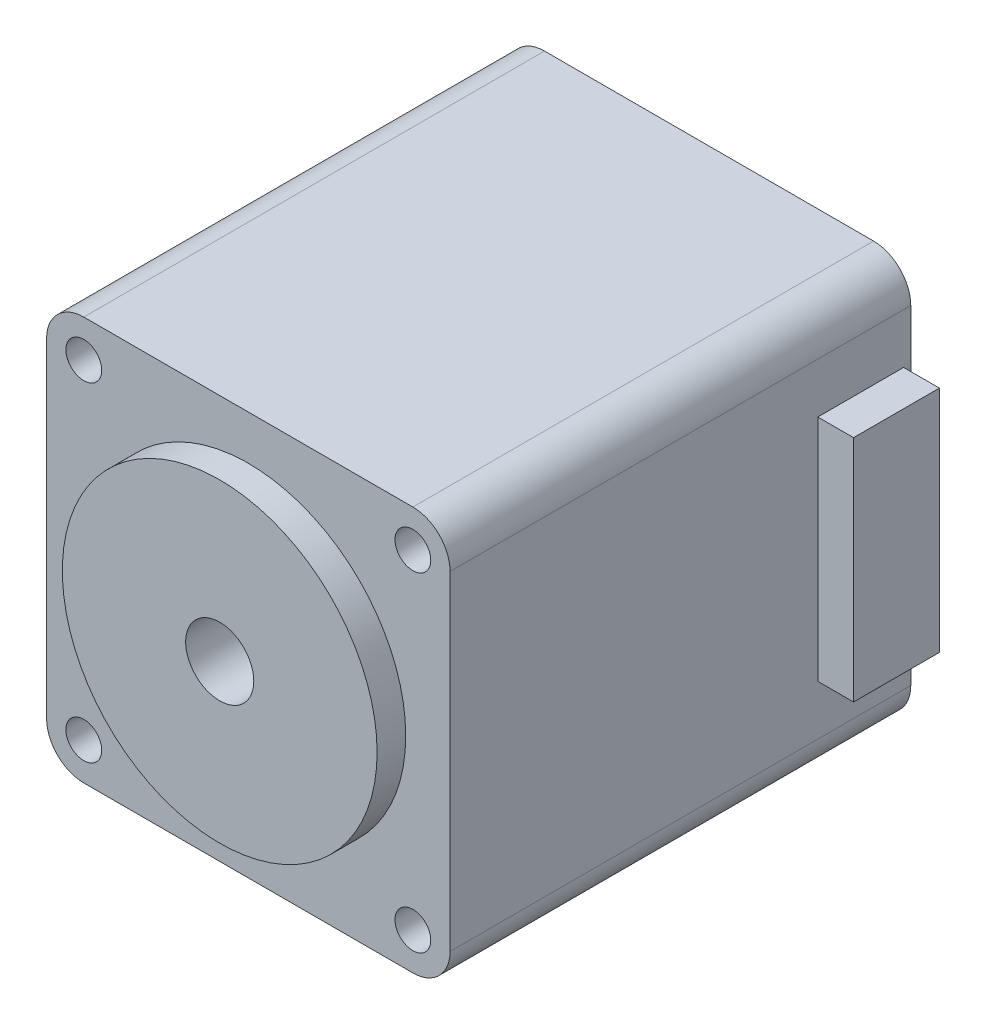
ISO-10303-21;
HEADER;
FILE_DESCRIPTION(('STEP AP214'),'2;1');
FILE_NAME('part.step','',(''),(''),'','','');
FILE_SCHEMA(('AUTOMOTIVE_DESIGN { 1 0 10303 214 1 1 1 1 }'));
ENDSEC;
DATA;
#1=APPLICATION_CONTEXT('core data for automotive mechanical design processes');
#2=APPLICATION_PROTOCOL_DEFINITION('international standard','automotive_design',2000,#1);
#3=PRODUCT_CONTEXT('',#1,'mechanical');
#4=PRODUCT('Part','Part','',(#3));
#5=PRODUCT_RELATED_PRODUCT_CATEGORY('part','',(#4));
#6=PRODUCT_DEFINITION_FORMATION('','',#4);
#7=PRODUCT_DEFINITION_CONTEXT('part definition',#1,'design');
#8=PRODUCT_DEFINITION('design','',#6,#7);
#9=PRODUCT_DEFINITION_SHAPE('','',#8);
#10=(LENGTH_UNIT() NAMED_UNIT(*) SI_UNIT(.MILLI.,.METRE.));
#11=(NAMED_UNIT(*) PLANE_ANGLE_UNIT() SI_UNIT($,.RADIAN.));
#12=(NAMED_UNIT(*) SI_UNIT($,.STERADIAN.) SOLID_ANGLE_UNIT());
#13=UNCERTAINTY_MEASURE_WITH_UNIT(LENGTH_MEASURE(1.E-05),#10,'distance_accuracy_value','');
#14=(GEOMETRIC_REPRESENTATION_CONTEXT(3) GLOBAL_UNCERTAINTY_ASSIGNED_CONTEXT((#13)) GLOBAL_UNIT_ASSIGNED_CONTEXT((#10,
#11,#12)) REPRESENTATION_CONTEXT('',''));
#15=CARTESIAN_POINT('',(0.,0.,0.));
#16=DIRECTION('',(0.,0.,1.));
#17=DIRECTION('',(1.,0.,0.));
#18=AXIS2_PLACEMENT_3D('',#15,#16,#17);
#19=CARTESIAN_POINT('',(0.,0.,32.2));
#20=DIRECTION('',(0.,0.,1.));
#21=DIRECTION('',(1.,0.,0.));
#22=AXIS2_PLACEMENT_3D('',#19,#20,#21);
#23=PLANE('',#22);
#24=CARTESIAN_POINT('',(-11.5,-11.5,32.2));
#25=DIRECTION('',(0.,0.,1.));
#26=DIRECTION('',(1.,0.,0.));
#27=AXIS2_PLACEMENT_3D('',#24,#25,#26);
#28=CIRCLE('',#27,2.6);
#29=CARTESIAN_POINT('',(-11.5,-14.1,32.2));
#30=VERTEX_POINT('',#29);
#31=CARTESIAN_POINT('',(-14.1,-11.5,32.2));
#32=VERTEX_POINT('',#31);
#33=EDGE_CURVE('E224',#30,#32,#28,.F.);
#34=ORIENTED_EDGE('',*,*,#33,.F.);
#35=DIRECTION('',(-1.,0.,0.));
#36=VECTOR('',#35,1.);
#37=CARTESIAN_POINT('',(0.,-14.1,32.2));
#38=LINE('',#37,#36);
#39=CARTESIAN_POINT('',(11.5,-14.1,32.2));
#40=VERTEX_POINT('',#39);
#41=EDGE_CURVE('E251',#40,#30,#38,.T.);
#42=ORIENTED_EDGE('',*,*,#41,.F.);
#43=CARTESIAN_POINT('',(11.5,-11.5,32.2));
#44=DIRECTION('',(0.,0.,1.));
#45=DIRECTION('',(1.,0.,0.));
#46=AXIS2_PLACEMENT_3D('',#43,#44,#45);
#47=CIRCLE('',#46,2.6);
#48=CARTESIAN_POINT('',(14.1,-11.5,32.2));
#49=VERTEX_POINT('',#48);
#50=EDGE_CURVE('E237',#49,#40,#47,.F.);
#51=ORIENTED_EDGE('',*,*,#50,.F.);
#52=DIRECTION('',(0.,-1.,0.));
#53=VECTOR('',#52,1.);
#54=CARTESIAN_POINT('',(14.1,0.,32.2));
#55=LINE('',#54,#53);
#56=CARTESIAN_POINT('',(14.1,11.5,32.2));
#57=VERTEX_POINT('',#56);
#58=EDGE_CURVE('E250',#57,#49,#55,.T.);
#59=ORIENTED_EDGE('',*,*,#58,.F.);
#60=CARTESIAN_POINT('',(11.5,11.5,32.2));
#61=DIRECTION('',(0.,0.,1.));
#62=DIRECTION('',(1.,0.,0.));
#63=AXIS2_PLACEMENT_3D('',#60,#61,#62);
#64=CIRCLE('',#63,2.6);
#65=CARTESIAN_POINT('',(11.5,14.1,32.2));
#66=VERTEX_POINT('',#65);
#67=EDGE_CURVE('E184',#66,#57,#64,.F.);
#68=ORIENTED_EDGE('',*,*,#67,.F.);
#69=DIRECTION('',(-1.,0.,0.));
#70=VECTOR('',#69,1.);
#71=CARTESIAN_POINT('',(0.,14.1,32.2));
#72=LINE('',#71,#70);
#73=CARTESIAN_POINT('',(-11.5,14.1,32.2));
#74=VERTEX_POINT('',#73);
#75=EDGE_CURVE('E176',#66,#74,#72,.T.);
#76=ORIENTED_EDGE('',*,*,#75,.T.);
#77=CARTESIAN_POINT('',(-11.5,11.5,32.2));
#78=DIRECTION('',(0.,0.,1.));
#79=DIRECTION('',(1.,0.,0.));
#80=AXIS2_PLACEMENT_3D('',#77,#78,#79);
#81=CIRCLE('',#80,2.6);
#82=CARTESIAN_POINT('',(-14.1,11.5,32.2));
#83=VERTEX_POINT('',#82);
#84=EDGE_CURVE('E180',#74,#83,#81,.T.);
#85=ORIENTED_EDGE('',*,*,#84,.T.);
#86=DIRECTION('',(0.,-1.,0.));
#87=VECTOR('',#86,1.);
#88=CARTESIAN_POINT('',(-14.1,0.,32.2));
#89=LINE('',#88,#87);
#90=EDGE_CURVE('E122',#83,#32,#89,.T.);
#91=ORIENTED_EDGE('',*,*,#90,.T.);
#92=EDGE_LOOP('',(#34,#42,#51,#59,#68,#76,#85,#91));
#93=FACE_BOUND('',#92,.T.);
#94=CARTESIAN_POINT('',(-11.5,11.5,32.2));
#95=DIRECTION('',(0.,0.,1.));
#96=DIRECTION('',(1.,0.,0.));
#97=AXIS2_PLACEMENT_3D('',#94,#95,#96);
#98=CIRCLE('',#97,1.25);
#99=CARTESIAN_POINT('',(-10.25,11.5,32.2));
#100=VERTEX_POINT('',#99);
#101=EDGE_CURVE('E298',#100,#100,#98,.T.);
#102=ORIENTED_EDGE('',*,*,#101,.F.);
#103=EDGE_LOOP('',(#102));
#104=FACE_BOUND('',#103,.T.);
#105=CARTESIAN_POINT('',(11.5,11.5,32.2));
#106=DIRECTION('',(0.,0.,1.));
#107=DIRECTION('',(1.,0.,0.));
#108=AXIS2_PLACEMENT_3D('',#105,#106,#107);
#109=CIRCLE('',#108,1.25);
#110=CARTESIAN_POINT('',(12.75,11.5,32.2));
#111=VERTEX_POINT('',#110);
#112=EDGE_CURVE('E301',#111,#111,#109,.T.);
#113=ORIENTED_EDGE('',*,*,#112,.F.);
#114=EDGE_LOOP('',(#113));
#115=FACE_BOUND('',#114,.T.);
#116=CARTESIAN_POINT('',(11.5,-11.5,32.2));
#117=DIRECTION('',(0.,0.,1.));
#118=DIRECTION('',(1.,0.,0.));
#119=AXIS2_PLACEMENT_3D('',#116,#117,#118);
#120=CIRCLE('',#119,1.25);
#121=CARTESIAN_POINT('',(12.75,-11.5,32.2));
#122=VERTEX_POINT('',#121);
#123=EDGE_CURVE('E314',#122,#122,#120,.T.);
#124=ORIENTED_EDGE('',*,*,#123,.F.);
#125=EDGE_LOOP('',(#124));
#126=FACE_BOUND('',#125,.T.);
#127=CARTESIAN_POINT('',(-11.5,-11.5,32.2));
#128=DIRECTION('',(0.,0.,1.));
#129=DIRECTION('',(1.,0.,0.));
#130=AXIS2_PLACEMENT_3D('',#127,#128,#129);
#131=CIRCLE('',#130,1.25);
#132=CARTESIAN_POINT('',(-10.25,-11.5,32.2));
#133=VERTEX_POINT('',#132);
#134=EDGE_CURVE('E307',#133,#133,#131,.T.);
#135=ORIENTED_EDGE('',*,*,#134,.F.);
#136=EDGE_LOOP('',(#135));
#137=FACE_BOUND('',#136,.T.);
#138=CARTESIAN_POINT('',(0.,0.,32.2));
#139=DIRECTION('',(0.,0.,1.));
#140=DIRECTION('',(1.,0.,0.));
#141=AXIS2_PLACEMENT_3D('',#138,#139,#140);
#142=CIRCLE('',#141,11.);
#143=CARTESIAN_POINT('',(11.,0.,32.2));
#144=VERTEX_POINT('',#143);
#145=EDGE_CURVE('E322',#144,#144,#142,.T.);
#146=ORIENTED_EDGE('',*,*,#145,.F.);
#147=EDGE_LOOP('',(#146));
#148=FACE_BOUND('',#147,.T.);
#149=ADVANCED_FACE('F98',(#93,#104,#115,#126,#137,#148),#23,.T.);
#150=CARTESIAN_POINT('',(0.,0.,32.2));
#151=DIRECTION('',(0.,0.,-1.));
#152=DIRECTION('',(-1.,0.,0.));
#153=AXIS2_PLACEMENT_3D('',#150,#151,#152);
#154=CYLINDRICAL_SURFACE('',#153,2.38);
#155=CARTESIAN_POINT('',(0.,0.,0.));
#156=DIRECTION('',(0.,0.,1.));
#157=DIRECTION('',(1.,0.,0.));
#158=AXIS2_PLACEMENT_3D('',#155,#156,#157);
#159=CIRCLE('',#158,2.38);
#160=CARTESIAN_POINT('',(2.38,0.,0.));
#161=VERTEX_POINT('',#160);
#162=EDGE_CURVE('E207',#161,#161,#159,.T.);
#163=ORIENTED_EDGE('',*,*,#162,.F.);
#164=EDGE_LOOP('',(#163));
#165=FACE_BOUND('',#164,.T.);
#166=CARTESIAN_POINT('',(0.,0.,34.2));
#167=DIRECTION('',(0.,0.,1.));
#168=DIRECTION('',(1.,0.,0.));
#169=AXIS2_PLACEMENT_3D('',#166,#167,#168);
#170=CIRCLE('',#169,2.38);
#171=CARTESIAN_POINT('',(2.38,0.,34.2));
#172=VERTEX_POINT('',#171);
#173=EDGE_CURVE('E325',#172,#172,#170,.T.);
#174=ORIENTED_EDGE('',*,*,#173,.T.);
#175=EDGE_LOOP('',(#174));
#176=FACE_BOUND('',#175,.T.);
#177=ADVANCED_FACE('F331',(#165,#176),#154,.F.);
#178=CARTESIAN_POINT('',(0.,-14.1,32.2));
#179=DIRECTION('',(0.,-1.,0.));
#180=DIRECTION('',(1.,0.,0.));
#181=AXIS2_PLACEMENT_3D('',#178,#179,#180);
#182=PLANE('',#181);
#183=DIRECTION('',(-1.,0.,0.));
#184=VECTOR('',#183,1.);
#185=CARTESIAN_POINT('',(0.,-14.1,0.));
#186=LINE('',#185,#184);
#187=CARTESIAN_POINT('',(11.5,-14.1,0.));
#188=VERTEX_POINT('',#187);
#189=CARTESIAN_POINT('',(-11.5,-14.1,0.));
#190=VERTEX_POINT('',#189);
#191=EDGE_CURVE('E206',#188,#190,#186,.T.);
#192=ORIENTED_EDGE('',*,*,#191,.F.);
#193=DIRECTION('',(0.,0.,-1.));
#194=VECTOR('',#193,1.);
#195=CARTESIAN_POINT('',(11.5,-14.1,32.2));
#196=LINE('',#195,#194);
#197=EDGE_CURVE('E106',#40,#188,#196,.T.);
#198=ORIENTED_EDGE('',*,*,#197,.F.);
#199=ORIENTED_EDGE('',*,*,#41,.T.);
#200=DIRECTION('',(0.,0.,-1.));
#201=VECTOR('',#200,1.);
#202=CARTESIAN_POINT('',(-11.5,-14.1,32.2));
#203=LINE('',#202,#201);
#204=EDGE_CURVE('E12',#30,#190,#203,.T.);
#205=ORIENTED_EDGE('',*,*,#204,.T.);
#206=EDGE_LOOP('',(#192,#198,#199,#205));
#207=FACE_BOUND('',#206,.T.);
#208=ADVANCED_FACE('F241',(#207),#182,.T.);
#209=CARTESIAN_POINT('',(11.5,-11.5,32.2));
#210=DIRECTION('',(0.,0.,-1.));
#211=DIRECTION('',(-1.,0.,0.));
#212=AXIS2_PLACEMENT_3D('',#209,#210,#211);
#213=CYLINDRICAL_SURFACE('',#212,2.6);
#214=CARTESIAN_POINT('',(11.5,-11.5,0.));
#215=DIRECTION('',(0.,0.,1.));
#216=DIRECTION('',(1.,0.,0.));
#217=AXIS2_PLACEMENT_3D('',#214,#215,#216);
#218=CIRCLE('',#217,2.6);
#219=CARTESIAN_POINT('',(14.1,-11.5,0.));
#220=VERTEX_POINT('',#219);
#221=EDGE_CURVE('E210',#220,#188,#218,.F.);
#222=ORIENTED_EDGE('',*,*,#221,.F.);
#223=DIRECTION('',(0.,0.,-1.));
#224=VECTOR('',#223,1.);
#225=CARTESIAN_POINT('',(14.1,-11.5,32.2));
#226=LINE('',#225,#224);
#227=EDGE_CURVE('E230',#49,#220,#226,.T.);
#228=ORIENTED_EDGE('',*,*,#227,.F.);
#229=ORIENTED_EDGE('',*,*,#50,.T.);
#230=ORIENTED_EDGE('',*,*,#197,.T.);
#231=EDGE_LOOP('',(#222,#228,#229,#230));
#232=FACE_BOUND('',#231,.T.);
#233=ADVANCED_FACE('F235',(#232),#213,.T.);
#234=CARTESIAN_POINT('',(14.1,0.,32.2));
#235=DIRECTION('',(1.,0.,0.));
#236=DIRECTION('',(0.,1.,0.));
#237=AXIS2_PLACEMENT_3D('',#234,#235,#236);
#238=PLANE('',#237);
#239=DIRECTION('',(0.,-1.,0.));
#240=VECTOR('',#239,1.);
#241=CARTESIAN_POINT('',(14.1,0.,6.5));
#242=LINE('',#241,#240);
#243=CARTESIAN_POINT('',(14.1,8.,6.5));
#244=VERTEX_POINT('',#243);
#245=CARTESIAN_POINT('',(14.1,-8.,6.5));
#246=VERTEX_POINT('',#245);
#247=EDGE_CURVE('E290',#244,#246,#242,.T.);
#248=ORIENTED_EDGE('',*,*,#247,.F.);
#249=DIRECTION('',(0.,0.,-1.));
#250=VECTOR('',#249,1.);
#251=CARTESIAN_POINT('',(14.1,8.,6.5));
#252=LINE('',#251,#250);
#253=CARTESIAN_POINT('',(14.1,8.,0.5));
#254=VERTEX_POINT('',#253);
#255=EDGE_CURVE('E267',#244,#254,#252,.T.);
#256=ORIENTED_EDGE('',*,*,#255,.T.);
#257=DIRECTION('',(0.,-1.,0.));
#258=VECTOR('',#257,1.);
#259=CARTESIAN_POINT('',(14.1,0.,0.5));
#260=LINE('',#259,#258);
#261=CARTESIAN_POINT('',(14.1,-8.,0.5));
#262=VERTEX_POINT('',#261);
#263=EDGE_CURVE('E278',#254,#262,#260,.T.);
#264=ORIENTED_EDGE('',*,*,#263,.T.);
#265=DIRECTION('',(0.,0.,-1.));
#266=VECTOR('',#265,1.);
#267=CARTESIAN_POINT('',(14.1,-8.,6.5));
#268=LINE('',#267,#266);
#269=EDGE_CURVE('E270',#246,#262,#268,.T.);
#270=ORIENTED_EDGE('',*,*,#269,.F.);
#271=EDGE_LOOP('',(#248,#256,#264,#270));
#272=FACE_BOUND('',#271,.T.);
#273=DIRECTION('',(0.,-1.,0.));
#274=VECTOR('',#273,1.);
#275=CARTESIAN_POINT('',(14.1,0.,0.));
#276=LINE('',#275,#274);
#277=CARTESIAN_POINT('',(14.1,11.5,0.));
#278=VERTEX_POINT('',#277);
#279=EDGE_CURVE('E213',#278,#220,#276,.T.);
#280=ORIENTED_EDGE('',*,*,#279,.F.);
#281=DIRECTION('',(0.,0.,-1.));
#282=VECTOR('',#281,1.);
#283=CARTESIAN_POINT('',(14.1,11.5,32.2));
#284=LINE('',#283,#282);
#285=EDGE_CURVE('E228',#57,#278,#284,.T.);
#286=ORIENTED_EDGE('',*,*,#285,.F.);
#287=ORIENTED_EDGE('',*,*,#58,.T.);
#288=ORIENTED_EDGE('',*,*,#227,.T.);
#289=EDGE_LOOP('',(#280,#286,#287,#288));
#290=FACE_BOUND('',#289,.T.);
#291=ADVANCED_FACE('F248',(#272,#290),#238,.T.);
#292=CARTESIAN_POINT('',(11.5,11.5,32.2));
#293=DIRECTION('',(0.,0.,-1.));
#294=DIRECTION('',(-1.,0.,0.));
#295=AXIS2_PLACEMENT_3D('',#292,#293,#294);
#296=CYLINDRICAL_SURFACE('',#295,2.6);
#297=CARTESIAN_POINT('',(11.5,11.5,0.));
#298=DIRECTION('',(0.,0.,1.));
#299=DIRECTION('',(1.,0.,0.));
#300=AXIS2_PLACEMENT_3D('',#297,#298,#299);
#301=CIRCLE('',#300,2.6);
#302=CARTESIAN_POINT('',(11.5,14.1,0.));
#303=VERTEX_POINT('',#302);
#304=EDGE_CURVE('E216',#303,#278,#301,.F.);
#305=ORIENTED_EDGE('',*,*,#304,.F.);
#306=DIRECTION('',(0.,0.,-1.));
#307=VECTOR('',#306,1.);
#308=CARTESIAN_POINT('',(11.5,14.1,32.2));
#309=LINE('',#308,#307);
#310=EDGE_CURVE('E194',#66,#303,#309,.T.);
#311=ORIENTED_EDGE('',*,*,#310,.F.);
#312=ORIENTED_EDGE('',*,*,#67,.T.);
#313=ORIENTED_EDGE('',*,*,#285,.T.);
#314=EDGE_LOOP('',(#305,#311,#312,#313));
#315=FACE_BOUND('',#314,.T.);
#316=ADVANCED_FACE('F257',(#315),#296,.T.);
#317=CARTESIAN_POINT('',(0.,14.1,32.2));
#318=DIRECTION('',(0.,-1.,0.));
#319=DIRECTION('',(1.,0.,0.));
#320=AXIS2_PLACEMENT_3D('',#317,#318,#319);
#321=PLANE('',#320);
#322=DIRECTION('',(-1.,0.,0.));
#323=VECTOR('',#322,1.);
#324=CARTESIAN_POINT('',(0.,14.1,0.));
#325=LINE('',#324,#323);
#326=CARTESIAN_POINT('',(-11.5,14.1,0.));
#327=VERTEX_POINT('',#326);
#328=EDGE_CURVE('E191',#303,#327,#325,.T.);
#329=ORIENTED_EDGE('',*,*,#328,.T.);
#330=DIRECTION('',(0.,0.,-1.));
#331=VECTOR('',#330,1.);
#332=CARTESIAN_POINT('',(-11.5,14.1,32.2));
#333=LINE('',#332,#331);
#334=EDGE_CURVE('E188',#74,#327,#333,.T.);
#335=ORIENTED_EDGE('',*,*,#334,.F.);
#336=ORIENTED_EDGE('',*,*,#75,.F.);
#337=ORIENTED_EDGE('',*,*,#310,.T.);
#338=EDGE_LOOP('',(#329,#335,#336,#337));
#339=FACE_BOUND('',#338,.T.);
#340=ADVANCED_FACE('F189',(#339),#321,.F.);
#341=CARTESIAN_POINT('',(-11.5,11.5,32.2));
#342=DIRECTION('',(0.,0.,-1.));
#343=DIRECTION('',(-1.,0.,0.));
#344=AXIS2_PLACEMENT_3D('',#341,#342,#343);
#345=CYLINDRICAL_SURFACE('',#344,2.6);
#346=CARTESIAN_POINT('',(-11.5,11.5,0.));
#347=DIRECTION('',(0.,0.,1.));
#348=DIRECTION('',(1.,0.,0.));
#349=AXIS2_PLACEMENT_3D('',#346,#347,#348);
#350=CIRCLE('',#349,2.6);
#351=CARTESIAN_POINT('',(-14.1,11.5,0.));
#352=VERTEX_POINT('',#351);
#353=EDGE_CURVE('E220',#327,#352,#350,.T.);
#354=ORIENTED_EDGE('',*,*,#353,.T.);
#355=DIRECTION('',(0.,0.,-1.));
#356=VECTOR('',#355,1.);
#357=CARTESIAN_POINT('',(-14.1,11.5,32.2));
#358=LINE('',#357,#356);
#359=EDGE_CURVE('E195',#83,#352,#358,.T.);
#360=ORIENTED_EDGE('',*,*,#359,.F.);
#361=ORIENTED_EDGE('',*,*,#84,.F.);
#362=ORIENTED_EDGE('',*,*,#334,.T.);
#363=EDGE_LOOP('',(#354,#360,#361,#362));
#364=FACE_BOUND('',#363,.T.);
#365=ADVANCED_FACE('F197',(#364),#345,.T.);
#366=CARTESIAN_POINT('',(-14.1,0.,32.2));
#367=DIRECTION('',(1.,0.,0.));
#368=DIRECTION('',(0.,1.,0.));
#369=AXIS2_PLACEMENT_3D('',#366,#367,#368);
#370=PLANE('',#369);
#371=DIRECTION('',(0.,-1.,0.));
#372=VECTOR('',#371,1.);
#373=CARTESIAN_POINT('',(-14.1,0.,0.));
#374=LINE('',#373,#372);
#375=CARTESIAN_POINT('',(-14.1,-11.5,0.));
#376=VERTEX_POINT('',#375);
#377=EDGE_CURVE('E222',#352,#376,#374,.T.);
#378=ORIENTED_EDGE('',*,*,#377,.T.);
#379=DIRECTION('',(0.,0.,-1.));
#380=VECTOR('',#379,1.);
#381=CARTESIAN_POINT('',(-14.1,-11.5,32.2));
#382=LINE('',#381,#380);
#383=EDGE_CURVE('E154',#32,#376,#382,.T.);
#384=ORIENTED_EDGE('',*,*,#383,.F.);
#385=ORIENTED_EDGE('',*,*,#90,.F.);
#386=ORIENTED_EDGE('',*,*,#359,.T.);
#387=EDGE_LOOP('',(#378,#384,#385,#386));
#388=FACE_BOUND('',#387,.T.);
#389=ADVANCED_FACE('F260',(#388),#370,.F.);
#390=CARTESIAN_POINT('',(-11.5,-11.5,32.2));
#391=DIRECTION('',(0.,0.,-1.));
#392=DIRECTION('',(-1.,0.,0.));
#393=AXIS2_PLACEMENT_3D('',#390,#391,#392);
#394=CYLINDRICAL_SURFACE('',#393,2.6);
#395=CARTESIAN_POINT('',(-11.5,-11.5,0.));
#396=DIRECTION('',(0.,0.,1.));
#397=DIRECTION('',(1.,0.,0.));
#398=AXIS2_PLACEMENT_3D('',#395,#396,#397);
#399=CIRCLE('',#398,2.6);
#400=EDGE_CURVE('E203',#190,#376,#399,.F.);
#401=ORIENTED_EDGE('',*,*,#400,.F.);
#402=ORIENTED_EDGE('',*,*,#204,.F.);
#403=ORIENTED_EDGE('',*,*,#33,.T.);
#404=ORIENTED_EDGE('',*,*,#383,.T.);
#405=EDGE_LOOP('',(#401,#402,#403,#404));
#406=FACE_BOUND('',#405,.T.);
#407=ADVANCED_FACE('F100',(#406),#394,.T.);
#408=CARTESIAN_POINT('',(0.,0.,0.));
#409=DIRECTION('',(0.,0.,1.));
#410=DIRECTION('',(1.,0.,0.));
#411=AXIS2_PLACEMENT_3D('',#408,#409,#410);
#412=PLANE('',#411);
#413=ORIENTED_EDGE('',*,*,#400,.T.);
#414=ORIENTED_EDGE('',*,*,#377,.F.);
#415=ORIENTED_EDGE('',*,*,#353,.F.);
#416=ORIENTED_EDGE('',*,*,#328,.F.);
#417=ORIENTED_EDGE('',*,*,#304,.T.);
#418=ORIENTED_EDGE('',*,*,#279,.T.);
#419=ORIENTED_EDGE('',*,*,#221,.T.);
#420=ORIENTED_EDGE('',*,*,#191,.T.);
#421=EDGE_LOOP('',(#413,#414,#415,#416,#417,#418,#419,#420));
#422=FACE_BOUND('',#421,.T.);
#423=ORIENTED_EDGE('',*,*,#162,.T.);
#424=EDGE_LOOP('',(#423));
#425=FACE_BOUND('',#424,.T.);
#426=ADVANCED_FACE('F243',(#422,#425),#412,.F.);
#427=CARTESIAN_POINT('',(16.6,0.,6.5));
#428=DIRECTION('',(-1.,0.,0.));
#429=DIRECTION('',(0.,0.,1.));
#430=AXIS2_PLACEMENT_3D('',#427,#428,#429);
#431=PLANE('',#430);
#432=DIRECTION('',(0.,1.,0.));
#433=VECTOR('',#432,1.);
#434=CARTESIAN_POINT('',(16.6,0.,0.5));
#435=LINE('',#434,#433);
#436=CARTESIAN_POINT('',(16.6,-8.,0.5));
#437=VERTEX_POINT('',#436);
#438=CARTESIAN_POINT('',(16.6,8.,0.5));
#439=VERTEX_POINT('',#438);
#440=EDGE_CURVE('E284',#437,#439,#435,.T.);
#441=ORIENTED_EDGE('',*,*,#440,.T.);
#442=DIRECTION('',(0.,0.,-1.));
#443=VECTOR('',#442,1.);
#444=CARTESIAN_POINT('',(16.6,8.,6.5));
#445=LINE('',#444,#443);
#446=CARTESIAN_POINT('',(16.6,8.,6.5));
#447=VERTEX_POINT('',#446);
#448=EDGE_CURVE('E264',#447,#439,#445,.T.);
#449=ORIENTED_EDGE('',*,*,#448,.F.);
#450=DIRECTION('',(0.,1.,0.));
#451=VECTOR('',#450,1.);
#452=CARTESIAN_POINT('',(16.6,0.,6.5));
#453=LINE('',#452,#451);
#454=CARTESIAN_POINT('',(16.6,-8.,6.5));
#455=VERTEX_POINT('',#454);
#456=EDGE_CURVE('E277',#455,#447,#453,.T.);
#457=ORIENTED_EDGE('',*,*,#456,.F.);
#458=DIRECTION('',(0.,0.,-1.));
#459=VECTOR('',#458,1.);
#460=CARTESIAN_POINT('',(16.6,-8.,6.5));
#461=LINE('',#460,#459);
#462=EDGE_CURVE('E272',#455,#437,#461,.T.);
#463=ORIENTED_EDGE('',*,*,#462,.T.);
#464=EDGE_LOOP('',(#441,#449,#457,#463));
#465=FACE_BOUND('',#464,.T.);
#466=ADVANCED_FACE('F359',(#465),#431,.F.);
#467=CARTESIAN_POINT('',(0.,8.,6.5));
#468=DIRECTION('',(0.,-1.,0.));
#469=DIRECTION('',(0.,0.,-1.));
#470=AXIS2_PLACEMENT_3D('',#467,#468,#469);
#471=PLANE('',#470);
#472=DIRECTION('',(-1.,0.,0.));
#473=VECTOR('',#472,1.);
#474=CARTESIAN_POINT('',(0.,8.,0.5));
#475=LINE('',#474,#473);
#476=EDGE_CURVE('E281',#439,#254,#475,.T.);
#477=ORIENTED_EDGE('',*,*,#476,.T.);
#478=ORIENTED_EDGE('',*,*,#255,.F.);
#479=DIRECTION('',(-1.,0.,0.));
#480=VECTOR('',#479,1.);
#481=CARTESIAN_POINT('',(0.,8.,6.5));
#482=LINE('',#481,#480);
#483=EDGE_CURVE('E293',#447,#244,#482,.T.);
#484=ORIENTED_EDGE('',*,*,#483,.F.);
#485=ORIENTED_EDGE('',*,*,#448,.T.);
#486=EDGE_LOOP('',(#477,#478,#484,#485));
#487=FACE_BOUND('',#486,.T.);
#488=ADVANCED_FACE('F416',(#487),#471,.F.);
#489=CARTESIAN_POINT('',(0.,-8.,6.5));
#490=DIRECTION('',(0.,1.,0.));
#491=DIRECTION('',(0.,0.,1.));
#492=AXIS2_PLACEMENT_3D('',#489,#490,#491);
#493=PLANE('',#492);
#494=DIRECTION('',(1.,0.,0.));
#495=VECTOR('',#494,1.);
#496=CARTESIAN_POINT('',(0.,-8.,0.5));
#497=LINE('',#496,#495);
#498=EDGE_CURVE('E113',#262,#437,#497,.T.);
#499=ORIENTED_EDGE('',*,*,#498,.T.);
#500=ORIENTED_EDGE('',*,*,#462,.F.);
#501=DIRECTION('',(1.,0.,0.));
#502=VECTOR('',#501,1.);
#503=CARTESIAN_POINT('',(0.,-8.,6.5));
#504=LINE('',#503,#502);
#505=EDGE_CURVE('E275',#246,#455,#504,.T.);
#506=ORIENTED_EDGE('',*,*,#505,.F.);
#507=ORIENTED_EDGE('',*,*,#269,.T.);
#508=EDGE_LOOP('',(#499,#500,#506,#507));
#509=FACE_BOUND('',#508,.T.);
#510=ADVANCED_FACE('F423',(#509),#493,.F.);
#511=CARTESIAN_POINT('',(0.,0.,6.5));
#512=DIRECTION('',(0.,0.,1.));
#513=DIRECTION('',(1.,0.,0.));
#514=AXIS2_PLACEMENT_3D('',#511,#512,#513);
#515=PLANE('',#514);
#516=ORIENTED_EDGE('',*,*,#456,.T.);
#517=ORIENTED_EDGE('',*,*,#483,.T.);
#518=ORIENTED_EDGE('',*,*,#247,.T.);
#519=ORIENTED_EDGE('',*,*,#505,.T.);
#520=EDGE_LOOP('',(#516,#517,#518,#519));
#521=FACE_BOUND('',#520,.T.);
#522=ADVANCED_FACE('F431',(#521),#515,.T.);
#523=CARTESIAN_POINT('',(0.,0.,0.5));
#524=DIRECTION('',(0.,0.,1.));
#525=DIRECTION('',(1.,0.,0.));
#526=AXIS2_PLACEMENT_3D('',#523,#524,#525);
#527=PLANE('',#526);
#528=ORIENTED_EDGE('',*,*,#440,.F.);
#529=ORIENTED_EDGE('',*,*,#498,.F.);
#530=ORIENTED_EDGE('',*,*,#263,.F.);
#531=ORIENTED_EDGE('',*,*,#476,.F.);
#532=EDGE_LOOP('',(#528,#529,#530,#531));
#533=FACE_BOUND('',#532,.T.);
#534=ADVANCED_FACE('F439',(#533),#527,.F.);
#535=CARTESIAN_POINT('',(-11.5,11.5,30.2));
#536=DIRECTION('',(0.,0.,1.));
#537=DIRECTION('',(1.,0.,0.));
#538=AXIS2_PLACEMENT_3D('',#535,#536,#537);
#539=CYLINDRICAL_SURFACE('',#538,1.25);
#540=CARTESIAN_POINT('',(-11.5,11.5,30.2));
#541=DIRECTION('',(0.,0.,1.));
#542=DIRECTION('',(1.,0.,0.));
#543=AXIS2_PLACEMENT_3D('',#540,#541,#542);
#544=CIRCLE('',#543,1.25);
#545=CARTESIAN_POINT('',(-10.25,11.5,30.2));
#546=VERTEX_POINT('',#545);
#547=EDGE_CURVE('E287',#546,#546,#544,.T.);
#548=ORIENTED_EDGE('',*,*,#547,.F.);
#549=EDGE_LOOP('',(#548));
#550=FACE_BOUND('',#549,.T.);
#551=ORIENTED_EDGE('',*,*,#101,.T.);
#552=EDGE_LOOP('',(#551));
#553=FACE_BOUND('',#552,.T.);
#554=ADVANCED_FACE('F447',(#550,#553),#539,.F.);
#555=CARTESIAN_POINT('',(-11.5,11.5,30.2));
#556=DIRECTION('',(0.,0.,1.));
#557=DIRECTION('',(1.,0.,0.));
#558=AXIS2_PLACEMENT_3D('',#555,#556,#557);
#559=PLANE('',#558);
#560=ORIENTED_EDGE('',*,*,#547,.T.);
#561=EDGE_LOOP('',(#560));
#562=FACE_BOUND('',#561,.T.);
#563=ADVANCED_FACE('F454',(#562),#559,.T.);
#564=CARTESIAN_POINT('',(11.5,11.5,30.2));
#565=DIRECTION('',(0.,0.,1.));
#566=DIRECTION('',(1.,0.,0.));
#567=AXIS2_PLACEMENT_3D('',#564,#565,#566);
#568=CYLINDRICAL_SURFACE('',#567,1.25);
#569=CARTESIAN_POINT('',(11.5,11.5,30.2));
#570=DIRECTION('',(0.,0.,1.));
#571=DIRECTION('',(1.,0.,0.));
#572=AXIS2_PLACEMENT_3D('',#569,#570,#571);
#573=CIRCLE('',#572,1.25);
#574=CARTESIAN_POINT('',(12.75,11.5,30.2));
#575=VERTEX_POINT('',#574);
#576=EDGE_CURVE('E317',#575,#575,#573,.T.);
#577=ORIENTED_EDGE('',*,*,#576,.F.);
#578=EDGE_LOOP('',(#577));
#579=FACE_BOUND('',#578,.T.);
#580=ORIENTED_EDGE('',*,*,#112,.T.);
#581=EDGE_LOOP('',(#580));
#582=FACE_BOUND('',#581,.T.);
#583=ADVANCED_FACE('F462',(#579,#582),#568,.F.);
#584=CARTESIAN_POINT('',(11.5,11.5,30.2));
#585=DIRECTION('',(0.,0.,1.));
#586=DIRECTION('',(1.,0.,0.));
#587=AXIS2_PLACEMENT_3D('',#584,#585,#586);
#588=PLANE('',#587);
#589=ORIENTED_EDGE('',*,*,#576,.T.);
#590=EDGE_LOOP('',(#589));
#591=FACE_BOUND('',#590,.T.);
#592=ADVANCED_FACE('F470',(#591),#588,.T.);
#593=CARTESIAN_POINT('',(11.5,-11.5,30.2));
#594=DIRECTION('',(0.,0.,1.));
#595=DIRECTION('',(1.,0.,0.));
#596=AXIS2_PLACEMENT_3D('',#593,#594,#595);
#597=CYLINDRICAL_SURFACE('',#596,1.25);
#598=CARTESIAN_POINT('',(11.5,-11.5,30.2));
#599=DIRECTION('',(0.,0.,1.));
#600=DIRECTION('',(1.,0.,0.));
#601=AXIS2_PLACEMENT_3D('',#598,#599,#600);
#602=CIRCLE('',#601,1.25);
#603=CARTESIAN_POINT('',(12.75,-11.5,30.2));
#604=VERTEX_POINT('',#603);
#605=EDGE_CURVE('E311',#604,#604,#602,.T.);
#606=ORIENTED_EDGE('',*,*,#605,.F.);
#607=EDGE_LOOP('',(#606));
#608=FACE_BOUND('',#607,.T.);
#609=ORIENTED_EDGE('',*,*,#123,.T.);
#610=EDGE_LOOP('',(#609));
#611=FACE_BOUND('',#610,.T.);
#612=ADVANCED_FACE('F478',(#608,#611),#597,.F.);
#613=CARTESIAN_POINT('',(11.5,-11.5,30.2));
#614=DIRECTION('',(0.,0.,1.));
#615=DIRECTION('',(1.,0.,0.));
#616=AXIS2_PLACEMENT_3D('',#613,#614,#615);
#617=PLANE('',#616);
#618=ORIENTED_EDGE('',*,*,#605,.T.);
#619=EDGE_LOOP('',(#618));
#620=FACE_BOUND('',#619,.T.);
#621=ADVANCED_FACE('F486',(#620),#617,.T.);
#622=CARTESIAN_POINT('',(-11.5,-11.5,30.2));
#623=DIRECTION('',(0.,0.,1.));
#624=DIRECTION('',(1.,0.,0.));
#625=AXIS2_PLACEMENT_3D('',#622,#623,#624);
#626=CYLINDRICAL_SURFACE('',#625,1.25);
#627=CARTESIAN_POINT('',(-11.5,-11.5,30.2));
#628=DIRECTION('',(0.,0.,1.));
#629=DIRECTION('',(1.,0.,0.));
#630=AXIS2_PLACEMENT_3D('',#627,#628,#629);
#631=CIRCLE('',#630,1.25);
#632=CARTESIAN_POINT('',(-10.25,-11.5,30.2));
#633=VERTEX_POINT('',#632);
#634=EDGE_CURVE('E304',#633,#633,#631,.T.);
#635=ORIENTED_EDGE('',*,*,#634,.F.);
#636=EDGE_LOOP('',(#635));
#637=FACE_BOUND('',#636,.T.);
#638=ORIENTED_EDGE('',*,*,#134,.T.);
#639=EDGE_LOOP('',(#638));
#640=FACE_BOUND('',#639,.T.);
#641=ADVANCED_FACE('F345',(#637,#640),#626,.F.);
#642=CARTESIAN_POINT('',(-11.5,-11.5,30.2));
#643=DIRECTION('',(0.,0.,1.));
#644=DIRECTION('',(1.,0.,0.));
#645=AXIS2_PLACEMENT_3D('',#642,#643,#644);
#646=PLANE('',#645);
#647=ORIENTED_EDGE('',*,*,#634,.T.);
#648=EDGE_LOOP('',(#647));
#649=FACE_BOUND('',#648,.T.);
#650=ADVANCED_FACE('F336',(#649),#646,.T.);
#651=CARTESIAN_POINT('',(0.,0.,34.2));
#652=DIRECTION('',(0.,0.,1.));
#653=DIRECTION('',(1.,0.,0.));
#654=AXIS2_PLACEMENT_3D('',#651,#652,#653);
#655=PLANE('',#654);
#656=CARTESIAN_POINT('',(0.,0.,34.2));
#657=DIRECTION('',(0.,0.,1.));
#658=DIRECTION('',(1.,0.,0.));
#659=AXIS2_PLACEMENT_3D('',#656,#657,#658);
#660=CIRCLE('',#659,11.);
#661=CARTESIAN_POINT('',(11.,0.,34.2));
#662=VERTEX_POINT('',#661);
#663=EDGE_CURVE('E308',#662,#662,#660,.T.);
#664=ORIENTED_EDGE('',*,*,#663,.T.);
#665=EDGE_LOOP('',(#664));
#666=FACE_BOUND('',#665,.T.);
#667=ORIENTED_EDGE('',*,*,#173,.F.);
#668=EDGE_LOOP('',(#667));
#669=FACE_BOUND('',#668,.T.);
#670=ADVANCED_FACE('F333',(#666,#669),#655,.T.);
#671=CARTESIAN_POINT('',(0.,0.,34.2));
#672=DIRECTION('',(0.,0.,-1.));
#673=DIRECTION('',(-1.,0.,0.));
#674=AXIS2_PLACEMENT_3D('',#671,#672,#673);
#675=CYLINDRICAL_SURFACE('',#674,11.);
#676=ORIENTED_EDGE('',*,*,#663,.F.);
#677=EDGE_LOOP('',(#676));
#678=FACE_BOUND('',#677,.T.);
#679=ORIENTED_EDGE('',*,*,#145,.T.);
#680=EDGE_LOOP('',(#679));
#681=FACE_BOUND('',#680,.T.);
#682=ADVANCED_FACE('F335',(#678,#681),#675,.T.);
#683=CLOSED_SHELL('',(#149,#177,#208,#233,#291,#316,#340,#365,#389,#407,#426,#466,#488,#510,
#522,#534,#554,#563,#583,#592,#612,#621,#641,#650,#670,#682));
#684=MANIFOLD_SOLID_BREP('B2',#683);
#685=ADVANCED_BREP_SHAPE_REPRESENTATION('',(#18,#684),#14);
#686=SHAPE_DEFINITION_REPRESENTATION(#9,#685);
ENDSEC;
END-ISO-10303-21;
